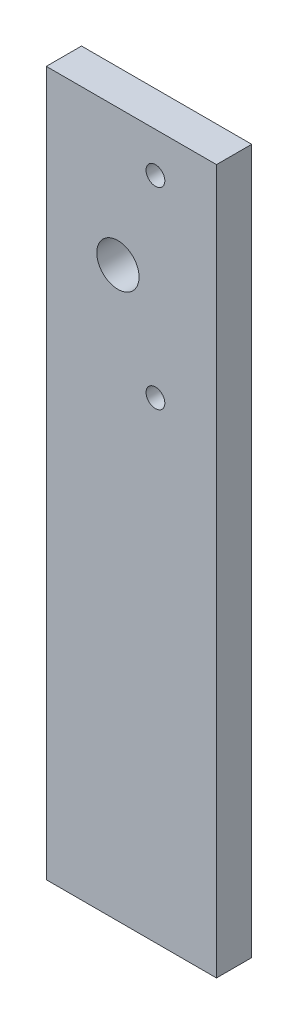
ISO-10303-21;
HEADER;
FILE_DESCRIPTION(('STEP AP214'),'2;1');
FILE_NAME('part.step','',(''),(''),'','','');
FILE_SCHEMA(('AUTOMOTIVE_DESIGN { 1 0 10303 214 1 1 1 1 }'));
ENDSEC;
DATA;
#1=APPLICATION_CONTEXT('core data for automotive mechanical design processes');
#2=APPLICATION_PROTOCOL_DEFINITION('international standard','automotive_design',2000,#1);
#3=PRODUCT_CONTEXT('',#1,'mechanical');
#4=PRODUCT('Part','Part','',(#3));
#5=PRODUCT_RELATED_PRODUCT_CATEGORY('part','',(#4));
#6=PRODUCT_DEFINITION_FORMATION('','',#4);
#7=PRODUCT_DEFINITION_CONTEXT('part definition',#1,'design');
#8=PRODUCT_DEFINITION('design','',#6,#7);
#9=PRODUCT_DEFINITION_SHAPE('','',#8);
#10=(LENGTH_UNIT() NAMED_UNIT(*) SI_UNIT(.MILLI.,.METRE.));
#11=(NAMED_UNIT(*) PLANE_ANGLE_UNIT() SI_UNIT($,.RADIAN.));
#12=(NAMED_UNIT(*) SI_UNIT($,.STERADIAN.) SOLID_ANGLE_UNIT());
#13=UNCERTAINTY_MEASURE_WITH_UNIT(LENGTH_MEASURE(1.E-05),#10,'distance_accuracy_value','');
#14=(GEOMETRIC_REPRESENTATION_CONTEXT(3) GLOBAL_UNCERTAINTY_ASSIGNED_CONTEXT((#13)) GLOBAL_UNIT_ASSIGNED_CONTEXT((#10,
#11,#12)) REPRESENTATION_CONTEXT('',''));
#15=CARTESIAN_POINT('',(0.,0.,0.));
#16=DIRECTION('',(0.,0.,1.));
#17=DIRECTION('',(1.,0.,0.));
#18=AXIS2_PLACEMENT_3D('',#15,#16,#17);
#19=CARTESIAN_POINT('',(0.,0.,15.));
#20=DIRECTION('',(0.,0.,-1.));
#21=DIRECTION('',(-1.,0.,0.));
#22=AXIS2_PLACEMENT_3D('',#19,#20,#21);
#23=PLANE('',#22);
#24=CARTESIAN_POINT('',(46.48,201.,15.));
#25=DIRECTION('',(0.,0.,1.));
#26=DIRECTION('',(1.,0.,0.));
#27=AXIS2_PLACEMENT_3D('',#24,#25,#26);
#28=CIRCLE('',#27,4.00000000000001);
#29=CARTESIAN_POINT('',(50.48,201.,15.));
#30=VERTEX_POINT('',#29);
#31=EDGE_CURVE('E115',#30,#30,#28,.T.);
#32=ORIENTED_EDGE('',*,*,#31,.F.);
#33=EDGE_LOOP('',(#32));
#34=FACE_BOUND('',#33,.T.);
#35=DIRECTION('',(0.,-1.,0.));
#36=VECTOR('',#35,1.);
#37=CARTESIAN_POINT('',(0.,0.,15.));
#38=LINE('',#37,#36);
#39=CARTESIAN_POINT('',(0.,300.,15.));
#40=VERTEX_POINT('',#39);
#41=CARTESIAN_POINT('',(0.,0.,15.));
#42=VERTEX_POINT('',#41);
#43=EDGE_CURVE('E85',#40,#42,#38,.T.);
#44=ORIENTED_EDGE('',*,*,#43,.T.);
#45=DIRECTION('',(1.,0.,0.));
#46=VECTOR('',#45,1.);
#47=CARTESIAN_POINT('',(0.,0.,15.));
#48=LINE('',#47,#46);
#49=CARTESIAN_POINT('',(72.48,0.,15.));
#50=VERTEX_POINT('',#49);
#51=EDGE_CURVE('E80',#42,#50,#48,.T.);
#52=ORIENTED_EDGE('',*,*,#51,.T.);
#53=DIRECTION('',(0.,1.,0.));
#54=VECTOR('',#53,1.);
#55=CARTESIAN_POINT('',(72.48,0.,15.));
#56=LINE('',#55,#54);
#57=CARTESIAN_POINT('',(72.48,300.,15.));
#58=VERTEX_POINT('',#57);
#59=EDGE_CURVE('E83',#50,#58,#56,.T.);
#60=ORIENTED_EDGE('',*,*,#59,.T.);
#61=DIRECTION('',(-1.,0.,0.));
#62=VECTOR('',#61,1.);
#63=CARTESIAN_POINT('',(0.,300.,15.));
#64=LINE('',#63,#62);
#65=EDGE_CURVE('E50',#58,#40,#64,.T.);
#66=ORIENTED_EDGE('',*,*,#65,.T.);
#67=EDGE_LOOP('',(#44,#52,#60,#66));
#68=FACE_BOUND('',#67,.T.);
#69=CARTESIAN_POINT('',(46.48,283.,15.));
#70=DIRECTION('',(0.,0.,1.));
#71=DIRECTION('',(1.,0.,0.));
#72=AXIS2_PLACEMENT_3D('',#69,#70,#71);
#73=CIRCLE('',#72,4.00000000000001);
#74=CARTESIAN_POINT('',(50.48,283.,15.));
#75=VERTEX_POINT('',#74);
#76=EDGE_CURVE('E100',#75,#75,#73,.T.);
#77=ORIENTED_EDGE('',*,*,#76,.F.);
#78=EDGE_LOOP('',(#77));
#79=FACE_BOUND('',#78,.T.);
#80=CARTESIAN_POINT('',(30.5,242.,15.));
#81=DIRECTION('',(0.,0.,1.));
#82=DIRECTION('',(1.,0.,0.));
#83=AXIS2_PLACEMENT_3D('',#80,#81,#82);
#84=CIRCLE('',#83,9.00000000000001);
#85=CARTESIAN_POINT('',(39.5,242.,15.));
#86=VERTEX_POINT('',#85);
#87=EDGE_CURVE('E121',#86,#86,#84,.T.);
#88=ORIENTED_EDGE('',*,*,#87,.F.);
#89=EDGE_LOOP('',(#88));
#90=FACE_BOUND('',#89,.T.);
#91=ADVANCED_FACE('F33',(#34,#68,#79,#90),#23,.F.);
#92=CARTESIAN_POINT('',(0.,0.,0.));
#93=DIRECTION('',(0.,0.,-1.));
#94=DIRECTION('',(-1.,0.,0.));
#95=AXIS2_PLACEMENT_3D('',#92,#93,#94);
#96=PLANE('',#95);
#97=CARTESIAN_POINT('',(46.48,201.,0.));
#98=DIRECTION('',(0.,0.,1.));
#99=DIRECTION('',(1.,0.,0.));
#100=AXIS2_PLACEMENT_3D('',#97,#98,#99);
#101=CIRCLE('',#100,4.00000000000001);
#102=CARTESIAN_POINT('',(50.48,201.,0.));
#103=VERTEX_POINT('',#102);
#104=EDGE_CURVE('E118',#103,#103,#101,.T.);
#105=ORIENTED_EDGE('',*,*,#104,.T.);
#106=EDGE_LOOP('',(#105));
#107=FACE_BOUND('',#106,.T.);
#108=DIRECTION('',(0.,-1.,0.));
#109=VECTOR('',#108,1.);
#110=CARTESIAN_POINT('',(0.,0.,0.));
#111=LINE('',#110,#109);
#112=CARTESIAN_POINT('',(0.,300.,0.));
#113=VERTEX_POINT('',#112);
#114=CARTESIAN_POINT('',(0.,0.,0.));
#115=VERTEX_POINT('',#114);
#116=EDGE_CURVE('E97',#113,#115,#111,.T.);
#117=ORIENTED_EDGE('',*,*,#116,.F.);
#118=DIRECTION('',(-1.,0.,0.));
#119=VECTOR('',#118,1.);
#120=CARTESIAN_POINT('',(0.,300.,0.));
#121=LINE('',#120,#119);
#122=CARTESIAN_POINT('',(72.48,300.,0.));
#123=VERTEX_POINT('',#122);
#124=EDGE_CURVE('E73',#123,#113,#121,.T.);
#125=ORIENTED_EDGE('',*,*,#124,.F.);
#126=DIRECTION('',(0.,1.,0.));
#127=VECTOR('',#126,1.);
#128=CARTESIAN_POINT('',(72.48,0.,0.));
#129=LINE('',#128,#127);
#130=CARTESIAN_POINT('',(72.48,0.,0.));
#131=VERTEX_POINT('',#130);
#132=EDGE_CURVE('E67',#131,#123,#129,.T.);
#133=ORIENTED_EDGE('',*,*,#132,.F.);
#134=DIRECTION('',(1.,0.,0.));
#135=VECTOR('',#134,1.);
#136=CARTESIAN_POINT('',(0.,0.,0.));
#137=LINE('',#136,#135);
#138=EDGE_CURVE('E89',#115,#131,#137,.T.);
#139=ORIENTED_EDGE('',*,*,#138,.F.);
#140=EDGE_LOOP('',(#117,#125,#133,#139));
#141=FACE_BOUND('',#140,.T.);
#142=CARTESIAN_POINT('',(46.48,283.,0.));
#143=DIRECTION('',(0.,0.,1.));
#144=DIRECTION('',(1.,0.,0.));
#145=AXIS2_PLACEMENT_3D('',#142,#143,#144);
#146=CIRCLE('',#145,4.00000000000001);
#147=CARTESIAN_POINT('',(50.48,283.,0.));
#148=VERTEX_POINT('',#147);
#149=EDGE_CURVE('E112',#148,#148,#146,.T.);
#150=ORIENTED_EDGE('',*,*,#149,.T.);
#151=EDGE_LOOP('',(#150));
#152=FACE_BOUND('',#151,.T.);
#153=CARTESIAN_POINT('',(30.5,242.,0.));
#154=DIRECTION('',(0.,0.,1.));
#155=DIRECTION('',(1.,0.,0.));
#156=AXIS2_PLACEMENT_3D('',#153,#154,#155);
#157=CIRCLE('',#156,9.00000000000001);
#158=CARTESIAN_POINT('',(39.5,242.,0.));
#159=VERTEX_POINT('',#158);
#160=EDGE_CURVE('E124',#159,#159,#157,.T.);
#161=ORIENTED_EDGE('',*,*,#160,.T.);
#162=EDGE_LOOP('',(#161));
#163=FACE_BOUND('',#162,.T.);
#164=ADVANCED_FACE('F108',(#107,#141,#152,#163),#96,.T.);
#165=CARTESIAN_POINT('',(0.,0.,15.));
#166=DIRECTION('',(1.,0.,0.));
#167=DIRECTION('',(0.,0.,-1.));
#168=AXIS2_PLACEMENT_3D('',#165,#166,#167);
#169=PLANE('',#168);
#170=ORIENTED_EDGE('',*,*,#116,.T.);
#171=DIRECTION('',(0.,0.,-1.));
#172=VECTOR('',#171,1.);
#173=CARTESIAN_POINT('',(0.,0.,15.));
#174=LINE('',#173,#172);
#175=EDGE_CURVE('E11',#42,#115,#174,.T.);
#176=ORIENTED_EDGE('',*,*,#175,.F.);
#177=ORIENTED_EDGE('',*,*,#43,.F.);
#178=DIRECTION('',(0.,0.,-1.));
#179=VECTOR('',#178,1.);
#180=CARTESIAN_POINT('',(0.,300.,15.));
#181=LINE('',#180,#179);
#182=EDGE_CURVE('E93',#40,#113,#181,.T.);
#183=ORIENTED_EDGE('',*,*,#182,.T.);
#184=EDGE_LOOP('',(#170,#176,#177,#183));
#185=FACE_BOUND('',#184,.T.);
#186=ADVANCED_FACE('F35',(#185),#169,.F.);
#187=CARTESIAN_POINT('',(0.,0.,15.));
#188=DIRECTION('',(0.,1.,0.));
#189=DIRECTION('',(0.,0.,1.));
#190=AXIS2_PLACEMENT_3D('',#187,#188,#189);
#191=PLANE('',#190);
#192=ORIENTED_EDGE('',*,*,#138,.T.);
#193=DIRECTION('',(0.,0.,-1.));
#194=VECTOR('',#193,1.);
#195=CARTESIAN_POINT('',(72.48,0.,15.));
#196=LINE('',#195,#194);
#197=EDGE_CURVE('E42',#50,#131,#196,.T.);
#198=ORIENTED_EDGE('',*,*,#197,.F.);
#199=ORIENTED_EDGE('',*,*,#51,.F.);
#200=ORIENTED_EDGE('',*,*,#175,.T.);
#201=EDGE_LOOP('',(#192,#198,#199,#200));
#202=FACE_BOUND('',#201,.T.);
#203=ADVANCED_FACE('F88',(#202),#191,.F.);
#204=CARTESIAN_POINT('',(72.48,0.,15.));
#205=DIRECTION('',(-1.,0.,0.));
#206=DIRECTION('',(0.,0.,1.));
#207=AXIS2_PLACEMENT_3D('',#204,#205,#206);
#208=PLANE('',#207);
#209=ORIENTED_EDGE('',*,*,#132,.T.);
#210=DIRECTION('',(0.,0.,-1.));
#211=VECTOR('',#210,1.);
#212=CARTESIAN_POINT('',(72.48,300.,15.));
#213=LINE('',#212,#211);
#214=EDGE_CURVE('E90',#58,#123,#213,.T.);
#215=ORIENTED_EDGE('',*,*,#214,.F.);
#216=ORIENTED_EDGE('',*,*,#59,.F.);
#217=ORIENTED_EDGE('',*,*,#197,.T.);
#218=EDGE_LOOP('',(#209,#215,#216,#217));
#219=FACE_BOUND('',#218,.T.);
#220=ADVANCED_FACE('F91',(#219),#208,.F.);
#221=CARTESIAN_POINT('',(0.,300.,15.));
#222=DIRECTION('',(0.,-1.,0.));
#223=DIRECTION('',(0.,0.,-1.));
#224=AXIS2_PLACEMENT_3D('',#221,#222,#223);
#225=PLANE('',#224);
#226=ORIENTED_EDGE('',*,*,#124,.T.);
#227=ORIENTED_EDGE('',*,*,#182,.F.);
#228=ORIENTED_EDGE('',*,*,#65,.F.);
#229=ORIENTED_EDGE('',*,*,#214,.T.);
#230=EDGE_LOOP('',(#226,#227,#228,#229));
#231=FACE_BOUND('',#230,.T.);
#232=ADVANCED_FACE('F105',(#231),#225,.F.);
#233=CARTESIAN_POINT('',(46.48,283.,15.));
#234=DIRECTION('',(0.,0.,-1.));
#235=DIRECTION('',(-1.,0.,0.));
#236=AXIS2_PLACEMENT_3D('',#233,#234,#235);
#237=CYLINDRICAL_SURFACE('',#236,4.00000000000001);
#238=ORIENTED_EDGE('',*,*,#76,.T.);
#239=EDGE_LOOP('',(#238));
#240=FACE_BOUND('',#239,.T.);
#241=ORIENTED_EDGE('',*,*,#149,.F.);
#242=EDGE_LOOP('',(#241));
#243=FACE_BOUND('',#242,.T.);
#244=ADVANCED_FACE('F143',(#240,#243),#237,.F.);
#245=CARTESIAN_POINT('',(46.48,201.,15.));
#246=DIRECTION('',(0.,0.,-1.));
#247=DIRECTION('',(-1.,0.,0.));
#248=AXIS2_PLACEMENT_3D('',#245,#246,#247);
#249=CYLINDRICAL_SURFACE('',#248,4.00000000000001);
#250=ORIENTED_EDGE('',*,*,#31,.T.);
#251=EDGE_LOOP('',(#250));
#252=FACE_BOUND('',#251,.T.);
#253=ORIENTED_EDGE('',*,*,#104,.F.);
#254=EDGE_LOOP('',(#253));
#255=FACE_BOUND('',#254,.T.);
#256=ADVANCED_FACE('F189',(#252,#255),#249,.F.);
#257=CARTESIAN_POINT('',(30.5,242.,15.));
#258=DIRECTION('',(0.,0.,-1.));
#259=DIRECTION('',(-1.,0.,0.));
#260=AXIS2_PLACEMENT_3D('',#257,#258,#259);
#261=CYLINDRICAL_SURFACE('',#260,9.00000000000001);
#262=ORIENTED_EDGE('',*,*,#87,.T.);
#263=EDGE_LOOP('',(#262));
#264=FACE_BOUND('',#263,.T.);
#265=ORIENTED_EDGE('',*,*,#160,.F.);
#266=EDGE_LOOP('',(#265));
#267=FACE_BOUND('',#266,.T.);
#268=ADVANCED_FACE('F130',(#264,#267),#261,.F.);
#269=CLOSED_SHELL('',(#91,#164,#186,#203,#220,#232,#244,#256,#268));
#270=MANIFOLD_SOLID_BREP('B2',#269);
#271=ADVANCED_BREP_SHAPE_REPRESENTATION('',(#18,#270),#14);
#272=SHAPE_DEFINITION_REPRESENTATION(#9,#271);
ENDSEC;
END-ISO-10303-21;
